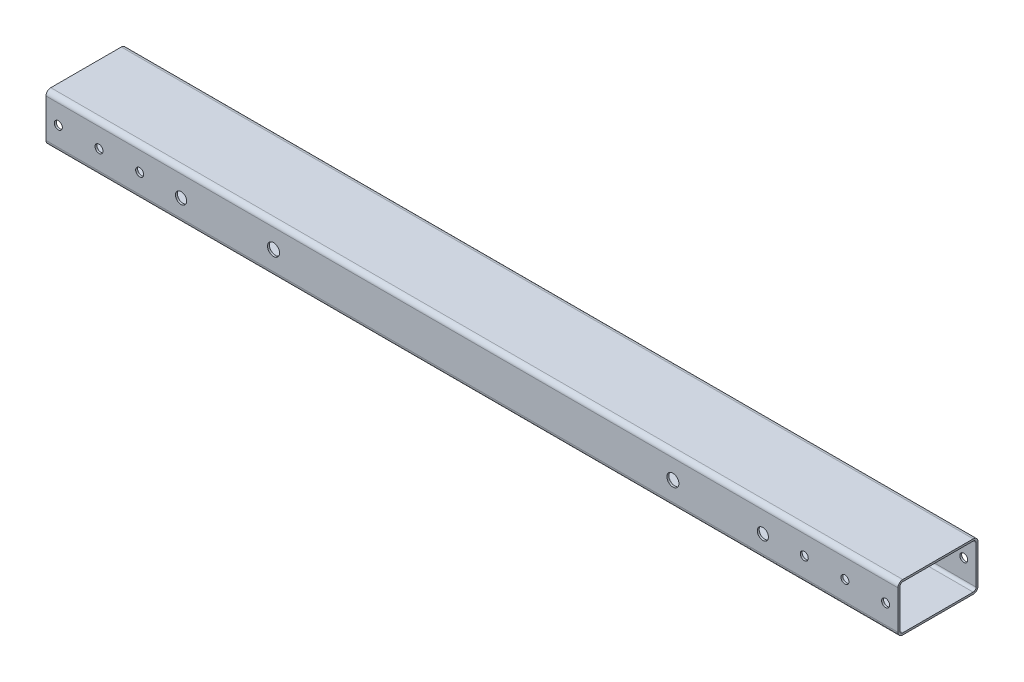
ISO-10303-21;
HEADER;
FILE_DESCRIPTION(('STEP AP214'),'2;1');
FILE_NAME('part.step','',(''),(''),'','','');
FILE_SCHEMA(('AUTOMOTIVE_DESIGN { 1 0 10303 214 1 1 1 1 }'));
ENDSEC;
DATA;
#1=APPLICATION_CONTEXT('core data for automotive mechanical design processes');
#2=APPLICATION_PROTOCOL_DEFINITION('international standard','automotive_design',2000,#1);
#3=PRODUCT_CONTEXT('',#1,'mechanical');
#4=PRODUCT('Part','Part','',(#3));
#5=PRODUCT_RELATED_PRODUCT_CATEGORY('part','',(#4));
#6=PRODUCT_DEFINITION_FORMATION('','',#4);
#7=PRODUCT_DEFINITION_CONTEXT('part definition',#1,'design');
#8=PRODUCT_DEFINITION('design','',#6,#7);
#9=PRODUCT_DEFINITION_SHAPE('','',#8);
#10=(LENGTH_UNIT() NAMED_UNIT(*) SI_UNIT(.MILLI.,.METRE.));
#11=(NAMED_UNIT(*) PLANE_ANGLE_UNIT() SI_UNIT($,.RADIAN.));
#12=(NAMED_UNIT(*) SI_UNIT($,.STERADIAN.) SOLID_ANGLE_UNIT());
#13=UNCERTAINTY_MEASURE_WITH_UNIT(LENGTH_MEASURE(1.E-05),#10,'distance_accuracy_value','');
#14=(GEOMETRIC_REPRESENTATION_CONTEXT(3) GLOBAL_UNCERTAINTY_ASSIGNED_CONTEXT((#13)) GLOBAL_UNIT_ASSIGNED_CONTEXT((#10,
#11,#12)) REPRESENTATION_CONTEXT('',''));
#15=CARTESIAN_POINT('',(0.,0.,0.));
#16=DIRECTION('',(0.,0.,1.));
#17=DIRECTION('',(1.,0.,0.));
#18=AXIS2_PLACEMENT_3D('',#15,#16,#17);
#19=CARTESIAN_POINT('',(532.,12.,22.));
#20=DIRECTION('',(-1.,0.,0.));
#21=DIRECTION('',(0.,0.,1.));
#22=AXIS2_PLACEMENT_3D('',#19,#20,#21);
#23=CYLINDRICAL_SURFACE('',#22,3.);
#24=CARTESIAN_POINT('',(0.,12.,22.));
#25=DIRECTION('',(1.,0.,0.));
#26=DIRECTION('',(0.,0.,-1.));
#27=AXIS2_PLACEMENT_3D('',#24,#25,#26);
#28=CIRCLE('',#27,3.);
#29=CARTESIAN_POINT('',(0.,15.,22.));
#30=VERTEX_POINT('',#29);
#31=CARTESIAN_POINT('',(0.,12.,25.));
#32=VERTEX_POINT('',#31);
#33=EDGE_CURVE('E256',#30,#32,#28,.T.);
#34=ORIENTED_EDGE('',*,*,#33,.T.);
#35=DIRECTION('',(-1.,0.,0.));
#36=VECTOR('',#35,1.);
#37=CARTESIAN_POINT('',(532.,12.,25.));
#38=LINE('',#37,#36);
#39=CARTESIAN_POINT('',(532.,12.,25.));
#40=VERTEX_POINT('',#39);
#41=EDGE_CURVE('E12',#40,#32,#38,.T.);
#42=ORIENTED_EDGE('',*,*,#41,.F.);
#43=CARTESIAN_POINT('',(532.,12.,22.));
#44=DIRECTION('',(1.,0.,0.));
#45=DIRECTION('',(0.,0.,-1.));
#46=AXIS2_PLACEMENT_3D('',#43,#44,#45);
#47=CIRCLE('',#46,3.);
#48=CARTESIAN_POINT('',(532.,15.,22.));
#49=VERTEX_POINT('',#48);
#50=EDGE_CURVE('E492',#49,#40,#47,.T.);
#51=ORIENTED_EDGE('',*,*,#50,.F.);
#52=DIRECTION('',(-1.,0.,0.));
#53=VECTOR('',#52,1.);
#54=CARTESIAN_POINT('',(532.,15.,22.));
#55=LINE('',#54,#53);
#56=EDGE_CURVE('E279',#49,#30,#55,.T.);
#57=ORIENTED_EDGE('',*,*,#56,.T.);
#58=EDGE_LOOP('',(#34,#42,#51,#57));
#59=FACE_BOUND('',#58,.T.);
#60=ADVANCED_FACE('F68',(#59),#23,.T.);
#61=CARTESIAN_POINT('',(532.,12.,25.));
#62=DIRECTION('',(0.,0.,-1.));
#63=DIRECTION('',(-1.,0.,0.));
#64=AXIS2_PLACEMENT_3D('',#61,#62,#63);
#65=PLANE('',#64);
#66=CARTESIAN_POINT('',(447.652173255853,-0.9847050473199,25.));
#67=DIRECTION('',(0.,0.,-1.));
#68=DIRECTION('',(-1.,0.,0.));
#69=AXIS2_PLACEMENT_3D('',#66,#67,#68);
#70=CIRCLE('',#69,3.50000000000002);
#71=CARTESIAN_POINT('',(444.152173255853,-0.9847050473199,25.));
#72=VERTEX_POINT('',#71);
#73=EDGE_CURVE('E360',#72,#72,#70,.T.);
#74=ORIENTED_EDGE('',*,*,#73,.T.);
#75=EDGE_LOOP('',(#74));
#76=FACE_BOUND('',#75,.T.);
#77=CARTESIAN_POINT('',(84.347826744147,-0.984705047320011,25.));
#78=DIRECTION('',(0.,0.,-1.));
#79=DIRECTION('',(-1.,0.,0.));
#80=AXIS2_PLACEMENT_3D('',#77,#78,#79);
#81=CIRCLE('',#80,3.50000000000001);
#82=CARTESIAN_POINT('',(80.847826744147,-0.984705047320011,25.));
#83=VERTEX_POINT('',#82);
#84=EDGE_CURVE('E376',#83,#83,#81,.T.);
#85=ORIENTED_EDGE('',*,*,#84,.T.);
#86=EDGE_LOOP('',(#85));
#87=FACE_BOUND('',#86,.T.);
#88=CARTESIAN_POINT('',(391.484705047324,0.,25.));
#89=DIRECTION('',(0.,0.,-1.));
#90=DIRECTION('',(-1.,0.,0.));
#91=AXIS2_PLACEMENT_3D('',#88,#89,#90);
#92=CIRCLE('',#91,3.74999999999998);
#93=CARTESIAN_POINT('',(387.734705047324,0.,25.));
#94=VERTEX_POINT('',#93);
#95=EDGE_CURVE('E353',#94,#94,#92,.T.);
#96=ORIENTED_EDGE('',*,*,#95,.T.);
#97=EDGE_LOOP('',(#96));
#98=FACE_BOUND('',#97,.T.);
#99=CARTESIAN_POINT('',(142.084705047324,0.,25.));
#100=DIRECTION('',(0.,0.,-1.));
#101=DIRECTION('',(-1.,0.,0.));
#102=AXIS2_PLACEMENT_3D('',#99,#100,#101);
#103=CIRCLE('',#102,3.75000000000001);
#104=CARTESIAN_POINT('',(138.334705047324,0.,25.));
#105=VERTEX_POINT('',#104);
#106=EDGE_CURVE('E382',#105,#105,#103,.T.);
#107=ORIENTED_EDGE('',*,*,#106,.T.);
#108=EDGE_LOOP('',(#107));
#109=FACE_BOUND('',#108,.T.);
#110=CARTESIAN_POINT('',(33.1,0.,25.));
#111=DIRECTION('',(0.,0.,-1.));
#112=DIRECTION('',(-1.,0.,0.));
#113=AXIS2_PLACEMENT_3D('',#110,#111,#112);
#114=CIRCLE('',#113,2.5);
#115=CARTESIAN_POINT('',(30.6,0.,25.));
#116=VERTEX_POINT('',#115);
#117=EDGE_CURVE('E411',#116,#116,#114,.T.);
#118=ORIENTED_EDGE('',*,*,#117,.T.);
#119=EDGE_LOOP('',(#118));
#120=FACE_BOUND('',#119,.T.);
#121=CARTESIAN_POINT('',(7.7,0.,25.));
#122=DIRECTION('',(0.,0.,-1.));
#123=DIRECTION('',(-1.,0.,0.));
#124=AXIS2_PLACEMENT_3D('',#121,#122,#123);
#125=CIRCLE('',#124,2.5);
#126=CARTESIAN_POINT('',(5.2,0.,25.));
#127=VERTEX_POINT('',#126);
#128=EDGE_CURVE('E419',#127,#127,#125,.T.);
#129=ORIENTED_EDGE('',*,*,#128,.T.);
#130=EDGE_LOOP('',(#129));
#131=FACE_BOUND('',#130,.T.);
#132=CARTESIAN_POINT('',(524.3,0.,25.));
#133=DIRECTION('',(0.,0.,-1.));
#134=DIRECTION('',(1.,0.,0.));
#135=AXIS2_PLACEMENT_3D('',#132,#133,#134);
#136=CIRCLE('',#135,2.50000000000014);
#137=CARTESIAN_POINT('',(526.8,0.,25.));
#138=VERTEX_POINT('',#137);
#139=EDGE_CURVE('E427',#138,#138,#136,.T.);
#140=ORIENTED_EDGE('',*,*,#139,.T.);
#141=EDGE_LOOP('',(#140));
#142=FACE_BOUND('',#141,.T.);
#143=CARTESIAN_POINT('',(498.9,0.,25.));
#144=DIRECTION('',(0.,0.,-1.));
#145=DIRECTION('',(1.,0.,0.));
#146=AXIS2_PLACEMENT_3D('',#143,#144,#145);
#147=CIRCLE('',#146,2.50000000000002);
#148=CARTESIAN_POINT('',(501.4,0.,25.));
#149=VERTEX_POINT('',#148);
#150=EDGE_CURVE('E402',#149,#149,#147,.T.);
#151=ORIENTED_EDGE('',*,*,#150,.T.);
#152=EDGE_LOOP('',(#151));
#153=FACE_BOUND('',#152,.T.);
#154=CARTESIAN_POINT('',(473.5,0.,25.));
#155=DIRECTION('',(0.,0.,-1.));
#156=DIRECTION('',(1.,0.,0.));
#157=AXIS2_PLACEMENT_3D('',#154,#155,#156);
#158=CIRCLE('',#157,2.50000000000002);
#159=CARTESIAN_POINT('',(476.,0.,25.));
#160=VERTEX_POINT('',#159);
#161=EDGE_CURVE('E397',#160,#160,#158,.T.);
#162=ORIENTED_EDGE('',*,*,#161,.T.);
#163=EDGE_LOOP('',(#162));
#164=FACE_BOUND('',#163,.T.);
#165=CARTESIAN_POINT('',(58.5,0.,25.));
#166=DIRECTION('',(0.,0.,-1.));
#167=DIRECTION('',(-1.,0.,0.));
#168=AXIS2_PLACEMENT_3D('',#165,#166,#167);
#169=CIRCLE('',#168,2.5);
#170=CARTESIAN_POINT('',(56.,0.,25.));
#171=VERTEX_POINT('',#170);
#172=EDGE_CURVE('E324',#171,#171,#169,.T.);
#173=ORIENTED_EDGE('',*,*,#172,.T.);
#174=EDGE_LOOP('',(#173));
#175=FACE_BOUND('',#174,.T.);
#176=DIRECTION('',(0.,-1.,0.));
#177=VECTOR('',#176,1.);
#178=CARTESIAN_POINT('',(0.,12.,25.));
#179=LINE('',#178,#177);
#180=CARTESIAN_POINT('',(0.,-12.,25.));
#181=VERTEX_POINT('',#180);
#182=EDGE_CURVE('E260',#32,#181,#179,.T.);
#183=ORIENTED_EDGE('',*,*,#182,.T.);
#184=DIRECTION('',(-1.,0.,0.));
#185=VECTOR('',#184,1.);
#186=CARTESIAN_POINT('',(532.,-12.,25.));
#187=LINE('',#186,#185);
#188=CARTESIAN_POINT('',(532.,-12.,25.));
#189=VERTEX_POINT('',#188);
#190=EDGE_CURVE('E79',#189,#181,#187,.T.);
#191=ORIENTED_EDGE('',*,*,#190,.F.);
#192=DIRECTION('',(0.,-1.,0.));
#193=VECTOR('',#192,1.);
#194=CARTESIAN_POINT('',(532.,12.,25.));
#195=LINE('',#194,#193);
#196=EDGE_CURVE('E495',#40,#189,#195,.T.);
#197=ORIENTED_EDGE('',*,*,#196,.F.);
#198=ORIENTED_EDGE('',*,*,#41,.T.);
#199=EDGE_LOOP('',(#183,#191,#197,#198));
#200=FACE_BOUND('',#199,.T.);
#201=ADVANCED_FACE('F591',(#76,#87,#98,#109,#120,#131,#142,#153,#164,#175,#200),#65,.F.);
#202=CARTESIAN_POINT('',(532.,-12.,22.));
#203=DIRECTION('',(-1.,0.,0.));
#204=DIRECTION('',(0.,0.,1.));
#205=AXIS2_PLACEMENT_3D('',#202,#203,#204);
#206=CYLINDRICAL_SURFACE('',#205,3.);
#207=CARTESIAN_POINT('',(0.,-12.,22.));
#208=DIRECTION('',(1.,0.,0.));
#209=DIRECTION('',(0.,0.,-1.));
#210=AXIS2_PLACEMENT_3D('',#207,#208,#209);
#211=CIRCLE('',#210,3.);
#212=CARTESIAN_POINT('',(0.,-15.,22.));
#213=VERTEX_POINT('',#212);
#214=EDGE_CURVE('E263',#181,#213,#211,.T.);
#215=ORIENTED_EDGE('',*,*,#214,.T.);
#216=DIRECTION('',(-1.,0.,0.));
#217=VECTOR('',#216,1.);
#218=CARTESIAN_POINT('',(532.,-15.,22.));
#219=LINE('',#218,#217);
#220=CARTESIAN_POINT('',(532.,-15.,22.));
#221=VERTEX_POINT('',#220);
#222=EDGE_CURVE('E290',#221,#213,#219,.T.);
#223=ORIENTED_EDGE('',*,*,#222,.F.);
#224=CARTESIAN_POINT('',(532.,-12.,22.));
#225=DIRECTION('',(1.,0.,0.));
#226=DIRECTION('',(0.,0.,-1.));
#227=AXIS2_PLACEMENT_3D('',#224,#225,#226);
#228=CIRCLE('',#227,3.);
#229=EDGE_CURVE('E498',#189,#221,#228,.T.);
#230=ORIENTED_EDGE('',*,*,#229,.F.);
#231=ORIENTED_EDGE('',*,*,#190,.T.);
#232=EDGE_LOOP('',(#215,#223,#230,#231));
#233=FACE_BOUND('',#232,.T.);
#234=ADVANCED_FACE('F596',(#233),#206,.T.);
#235=CARTESIAN_POINT('',(532.,-15.,-22.));
#236=DIRECTION('',(0.,1.,0.));
#237=DIRECTION('',(0.,0.,1.));
#238=AXIS2_PLACEMENT_3D('',#235,#236,#237);
#239=PLANE('',#238);
#240=DIRECTION('',(0.,0.,-1.));
#241=VECTOR('',#240,1.);
#242=CARTESIAN_POINT('',(0.,-15.,-22.));
#243=LINE('',#242,#241);
#244=CARTESIAN_POINT('',(0.,-15.,-22.));
#245=VERTEX_POINT('',#244);
#246=EDGE_CURVE('E266',#213,#245,#243,.T.);
#247=ORIENTED_EDGE('',*,*,#246,.T.);
#248=DIRECTION('',(-1.,0.,0.));
#249=VECTOR('',#248,1.);
#250=CARTESIAN_POINT('',(532.,-15.,-22.));
#251=LINE('',#250,#249);
#252=CARTESIAN_POINT('',(532.,-15.,-22.));
#253=VERTEX_POINT('',#252);
#254=EDGE_CURVE('E286',#253,#245,#251,.T.);
#255=ORIENTED_EDGE('',*,*,#254,.F.);
#256=DIRECTION('',(0.,0.,-1.));
#257=VECTOR('',#256,1.);
#258=CARTESIAN_POINT('',(532.,-15.,-22.));
#259=LINE('',#258,#257);
#260=EDGE_CURVE('E501',#221,#253,#259,.T.);
#261=ORIENTED_EDGE('',*,*,#260,.F.);
#262=ORIENTED_EDGE('',*,*,#222,.T.);
#263=EDGE_LOOP('',(#247,#255,#261,#262));
#264=FACE_BOUND('',#263,.T.);
#265=ADVANCED_FACE('F563',(#264),#239,.F.);
#266=CARTESIAN_POINT('',(532.,-12.,-22.));
#267=DIRECTION('',(-1.,0.,0.));
#268=DIRECTION('',(0.,0.,1.));
#269=AXIS2_PLACEMENT_3D('',#266,#267,#268);
#270=CYLINDRICAL_SURFACE('',#269,3.);
#271=CARTESIAN_POINT('',(0.,-12.,-22.));
#272=DIRECTION('',(1.,0.,0.));
#273=DIRECTION('',(0.,0.,-1.));
#274=AXIS2_PLACEMENT_3D('',#271,#272,#273);
#275=CIRCLE('',#274,3.);
#276=CARTESIAN_POINT('',(0.,-12.,-25.));
#277=VERTEX_POINT('',#276);
#278=EDGE_CURVE('E269',#245,#277,#275,.T.);
#279=ORIENTED_EDGE('',*,*,#278,.T.);
#280=DIRECTION('',(-1.,0.,0.));
#281=VECTOR('',#280,1.);
#282=CARTESIAN_POINT('',(532.,-12.,-25.));
#283=LINE('',#282,#281);
#284=CARTESIAN_POINT('',(532.,-12.,-25.));
#285=VERTEX_POINT('',#284);
#286=EDGE_CURVE('E211',#285,#277,#283,.T.);
#287=ORIENTED_EDGE('',*,*,#286,.F.);
#288=CARTESIAN_POINT('',(532.,-12.,-22.));
#289=DIRECTION('',(1.,0.,0.));
#290=DIRECTION('',(0.,0.,-1.));
#291=AXIS2_PLACEMENT_3D('',#288,#289,#290);
#292=CIRCLE('',#291,3.);
#293=EDGE_CURVE('E200',#253,#285,#292,.T.);
#294=ORIENTED_EDGE('',*,*,#293,.F.);
#295=ORIENTED_EDGE('',*,*,#254,.T.);
#296=EDGE_LOOP('',(#279,#287,#294,#295));
#297=FACE_BOUND('',#296,.T.);
#298=ADVANCED_FACE('F567',(#297),#270,.T.);
#299=CARTESIAN_POINT('',(532.,-12.,-25.));
#300=DIRECTION('',(0.,0.,1.));
#301=DIRECTION('',(1.,0.,0.));
#302=AXIS2_PLACEMENT_3D('',#299,#300,#301);
#303=PLANE('',#302);
#304=CARTESIAN_POINT('',(447.652173255853,-0.9847050473199,-25.));
#305=DIRECTION('',(0.,0.,-1.));
#306=DIRECTION('',(-1.,0.,0.));
#307=AXIS2_PLACEMENT_3D('',#304,#305,#306);
#308=CIRCLE('',#307,3.50000000000002);
#309=CARTESIAN_POINT('',(444.152173255853,-0.9847050473199,-25.));
#310=VERTEX_POINT('',#309);
#311=EDGE_CURVE('E366',#310,#310,#308,.T.);
#312=ORIENTED_EDGE('',*,*,#311,.F.);
#313=EDGE_LOOP('',(#312));
#314=FACE_BOUND('',#313,.T.);
#315=CARTESIAN_POINT('',(84.347826744147,-0.984705047320011,-25.));
#316=DIRECTION('',(0.,0.,-1.));
#317=DIRECTION('',(-1.,0.,0.));
#318=AXIS2_PLACEMENT_3D('',#315,#316,#317);
#319=CIRCLE('',#318,3.50000000000001);
#320=CARTESIAN_POINT('',(80.847826744147,-0.984705047320011,-25.));
#321=VERTEX_POINT('',#320);
#322=EDGE_CURVE('E371',#321,#321,#319,.T.);
#323=ORIENTED_EDGE('',*,*,#322,.F.);
#324=EDGE_LOOP('',(#323));
#325=FACE_BOUND('',#324,.T.);
#326=CARTESIAN_POINT('',(391.484705047324,0.,-25.));
#327=DIRECTION('',(0.,0.,-1.));
#328=DIRECTION('',(-1.,0.,0.));
#329=AXIS2_PLACEMENT_3D('',#326,#327,#328);
#330=CIRCLE('',#329,3.74999999999998);
#331=CARTESIAN_POINT('',(387.734705047324,0.,-25.));
#332=VERTEX_POINT('',#331);
#333=EDGE_CURVE('E385',#332,#332,#330,.T.);
#334=ORIENTED_EDGE('',*,*,#333,.F.);
#335=EDGE_LOOP('',(#334));
#336=FACE_BOUND('',#335,.T.);
#337=CARTESIAN_POINT('',(142.084705047324,0.,-25.));
#338=DIRECTION('',(0.,0.,-1.));
#339=DIRECTION('',(-1.,0.,0.));
#340=AXIS2_PLACEMENT_3D('',#337,#338,#339);
#341=CIRCLE('',#340,3.75000000000001);
#342=CARTESIAN_POINT('',(138.334705047324,0.,-25.));
#343=VERTEX_POINT('',#342);
#344=EDGE_CURVE('E388',#343,#343,#341,.T.);
#345=ORIENTED_EDGE('',*,*,#344,.F.);
#346=EDGE_LOOP('',(#345));
#347=FACE_BOUND('',#346,.T.);
#348=CARTESIAN_POINT('',(33.1,0.,-25.));
#349=DIRECTION('',(0.,0.,-1.));
#350=DIRECTION('',(-1.,0.,0.));
#351=AXIS2_PLACEMENT_3D('',#348,#349,#350);
#352=CIRCLE('',#351,2.5);
#353=CARTESIAN_POINT('',(30.6,0.,-25.));
#354=VERTEX_POINT('',#353);
#355=EDGE_CURVE('E406',#354,#354,#352,.T.);
#356=ORIENTED_EDGE('',*,*,#355,.F.);
#357=EDGE_LOOP('',(#356));
#358=FACE_BOUND('',#357,.T.);
#359=CARTESIAN_POINT('',(7.7,0.,-25.));
#360=DIRECTION('',(0.,0.,-1.));
#361=DIRECTION('',(-1.,0.,0.));
#362=AXIS2_PLACEMENT_3D('',#359,#360,#361);
#363=CIRCLE('',#362,2.5);
#364=CARTESIAN_POINT('',(5.2,0.,-25.));
#365=VERTEX_POINT('',#364);
#366=EDGE_CURVE('E415',#365,#365,#363,.T.);
#367=ORIENTED_EDGE('',*,*,#366,.F.);
#368=EDGE_LOOP('',(#367));
#369=FACE_BOUND('',#368,.T.);
#370=CARTESIAN_POINT('',(524.3,0.,-25.));
#371=DIRECTION('',(0.,0.,-1.));
#372=DIRECTION('',(1.,0.,0.));
#373=AXIS2_PLACEMENT_3D('',#370,#371,#372);
#374=CIRCLE('',#373,2.50000000000014);
#375=CARTESIAN_POINT('',(526.8,0.,-25.));
#376=VERTEX_POINT('',#375);
#377=EDGE_CURVE('E423',#376,#376,#374,.T.);
#378=ORIENTED_EDGE('',*,*,#377,.F.);
#379=EDGE_LOOP('',(#378));
#380=FACE_BOUND('',#379,.T.);
#381=CARTESIAN_POINT('',(498.9,0.,-25.));
#382=DIRECTION('',(0.,0.,-1.));
#383=DIRECTION('',(1.,0.,0.));
#384=AXIS2_PLACEMENT_3D('',#381,#382,#383);
#385=CIRCLE('',#384,2.50000000000002);
#386=CARTESIAN_POINT('',(501.4,0.,-25.));
#387=VERTEX_POINT('',#386);
#388=EDGE_CURVE('E431',#387,#387,#385,.T.);
#389=ORIENTED_EDGE('',*,*,#388,.F.);
#390=EDGE_LOOP('',(#389));
#391=FACE_BOUND('',#390,.T.);
#392=CARTESIAN_POINT('',(473.5,0.,-25.));
#393=DIRECTION('',(0.,0.,-1.));
#394=DIRECTION('',(1.,0.,0.));
#395=AXIS2_PLACEMENT_3D('',#392,#393,#394);
#396=CIRCLE('',#395,2.50000000000002);
#397=CARTESIAN_POINT('',(476.,0.,-25.));
#398=VERTEX_POINT('',#397);
#399=EDGE_CURVE('E398',#398,#398,#396,.T.);
#400=ORIENTED_EDGE('',*,*,#399,.F.);
#401=EDGE_LOOP('',(#400));
#402=FACE_BOUND('',#401,.T.);
#403=CARTESIAN_POINT('',(58.5,0.,-25.));
#404=DIRECTION('',(0.,0.,-1.));
#405=DIRECTION('',(-1.,0.,0.));
#406=AXIS2_PLACEMENT_3D('',#403,#404,#405);
#407=CIRCLE('',#406,2.5);
#408=CARTESIAN_POINT('',(56.,0.,-25.));
#409=VERTEX_POINT('',#408);
#410=EDGE_CURVE('E410',#409,#409,#407,.T.);
#411=ORIENTED_EDGE('',*,*,#410,.F.);
#412=EDGE_LOOP('',(#411));
#413=FACE_BOUND('',#412,.T.);
#414=DIRECTION('',(0.,1.,0.));
#415=VECTOR('',#414,1.);
#416=CARTESIAN_POINT('',(0.,-12.,-25.));
#417=LINE('',#416,#415);
#418=CARTESIAN_POINT('',(0.,12.,-25.));
#419=VERTEX_POINT('',#418);
#420=EDGE_CURVE('E209',#277,#419,#417,.T.);
#421=ORIENTED_EDGE('',*,*,#420,.T.);
#422=DIRECTION('',(-1.,0.,0.));
#423=VECTOR('',#422,1.);
#424=CARTESIAN_POINT('',(532.,12.,-25.));
#425=LINE('',#424,#423);
#426=CARTESIAN_POINT('',(532.,12.,-25.));
#427=VERTEX_POINT('',#426);
#428=EDGE_CURVE('E206',#427,#419,#425,.T.);
#429=ORIENTED_EDGE('',*,*,#428,.F.);
#430=DIRECTION('',(0.,1.,0.));
#431=VECTOR('',#430,1.);
#432=CARTESIAN_POINT('',(532.,-12.,-25.));
#433=LINE('',#432,#431);
#434=EDGE_CURVE('E194',#285,#427,#433,.T.);
#435=ORIENTED_EDGE('',*,*,#434,.F.);
#436=ORIENTED_EDGE('',*,*,#286,.T.);
#437=EDGE_LOOP('',(#421,#429,#435,#436));
#438=FACE_BOUND('',#437,.T.);
#439=ADVANCED_FACE('F207',(#314,#325,#336,#347,#358,#369,#380,#391,#402,#413,#438),#303,.F.);
#440=CARTESIAN_POINT('',(532.,12.,-22.));
#441=DIRECTION('',(-1.,0.,0.));
#442=DIRECTION('',(0.,0.,1.));
#443=AXIS2_PLACEMENT_3D('',#440,#441,#442);
#444=CYLINDRICAL_SURFACE('',#443,3.);
#445=CARTESIAN_POINT('',(0.,12.,-22.));
#446=DIRECTION('',(1.,0.,0.));
#447=DIRECTION('',(0.,0.,-1.));
#448=AXIS2_PLACEMENT_3D('',#445,#446,#447);
#449=CIRCLE('',#448,3.);
#450=CARTESIAN_POINT('',(0.,15.,-22.));
#451=VERTEX_POINT('',#450);
#452=EDGE_CURVE('E141',#419,#451,#449,.T.);
#453=ORIENTED_EDGE('',*,*,#452,.T.);
#454=DIRECTION('',(-1.,0.,0.));
#455=VECTOR('',#454,1.);
#456=CARTESIAN_POINT('',(532.,15.,-22.));
#457=LINE('',#456,#455);
#458=CARTESIAN_POINT('',(532.,15.,-22.));
#459=VERTEX_POINT('',#458);
#460=EDGE_CURVE('E212',#459,#451,#457,.T.);
#461=ORIENTED_EDGE('',*,*,#460,.F.);
#462=CARTESIAN_POINT('',(532.,12.,-22.));
#463=DIRECTION('',(1.,0.,0.));
#464=DIRECTION('',(0.,0.,-1.));
#465=AXIS2_PLACEMENT_3D('',#462,#463,#464);
#466=CIRCLE('',#465,3.);
#467=EDGE_CURVE('E198',#427,#459,#466,.T.);
#468=ORIENTED_EDGE('',*,*,#467,.F.);
#469=ORIENTED_EDGE('',*,*,#428,.T.);
#470=EDGE_LOOP('',(#453,#461,#468,#469));
#471=FACE_BOUND('',#470,.T.);
#472=ADVANCED_FACE('F214',(#471),#444,.T.);
#473=CARTESIAN_POINT('',(532.,-12.,22.));
#474=DIRECTION('',(-1.,0.,0.));
#475=DIRECTION('',(0.,0.,1.));
#476=AXIS2_PLACEMENT_3D('',#473,#474,#475);
#477=CYLINDRICAL_SURFACE('',#476,1.8);
#478=CARTESIAN_POINT('',(0.,-12.,22.));
#479=DIRECTION('',(1.,0.,0.));
#480=DIRECTION('',(0.,0.,-1.));
#481=AXIS2_PLACEMENT_3D('',#478,#479,#480);
#482=CIRCLE('',#481,1.8);
#483=CARTESIAN_POINT('',(0.,-12.,23.8));
#484=VERTEX_POINT('',#483);
#485=CARTESIAN_POINT('',(0.,-13.8,22.));
#486=VERTEX_POINT('',#485);
#487=EDGE_CURVE('E223',#484,#486,#482,.T.);
#488=ORIENTED_EDGE('',*,*,#487,.F.);
#489=DIRECTION('',(-1.,0.,0.));
#490=VECTOR('',#489,1.);
#491=CARTESIAN_POINT('',(532.,-12.,23.8));
#492=LINE('',#491,#490);
#493=CARTESIAN_POINT('',(532.,-12.,23.8));
#494=VERTEX_POINT('',#493);
#495=EDGE_CURVE('E155',#494,#484,#492,.T.);
#496=ORIENTED_EDGE('',*,*,#495,.F.);
#497=CARTESIAN_POINT('',(532.,-12.,22.));
#498=DIRECTION('',(1.,0.,0.));
#499=DIRECTION('',(0.,0.,-1.));
#500=AXIS2_PLACEMENT_3D('',#497,#498,#499);
#501=CIRCLE('',#500,1.8);
#502=CARTESIAN_POINT('',(532.,-13.8,22.));
#503=VERTEX_POINT('',#502);
#504=EDGE_CURVE('E278',#494,#503,#501,.T.);
#505=ORIENTED_EDGE('',*,*,#504,.T.);
#506=DIRECTION('',(-1.,0.,0.));
#507=VECTOR('',#506,1.);
#508=CARTESIAN_POINT('',(532.,-13.8,22.));
#509=LINE('',#508,#507);
#510=EDGE_CURVE('E219',#503,#486,#509,.T.);
#511=ORIENTED_EDGE('',*,*,#510,.T.);
#512=EDGE_LOOP('',(#488,#496,#505,#511));
#513=FACE_BOUND('',#512,.T.);
#514=ADVANCED_FACE('F70',(#513),#477,.F.);
#515=CARTESIAN_POINT('',(532.,12.,23.8));
#516=DIRECTION('',(0.,0.,-1.));
#517=DIRECTION('',(-1.,0.,0.));
#518=AXIS2_PLACEMENT_3D('',#515,#516,#517);
#519=PLANE('',#518);
#520=CARTESIAN_POINT('',(447.652173255853,-0.9847050473199,23.8));
#521=DIRECTION('',(0.,0.,-1.));
#522=DIRECTION('',(-1.,0.,0.));
#523=AXIS2_PLACEMENT_3D('',#520,#521,#522);
#524=CIRCLE('',#523,3.50000000000002);
#525=CARTESIAN_POINT('',(444.152173255853,-0.9847050473199,23.8));
#526=VERTEX_POINT('',#525);
#527=EDGE_CURVE('E379',#526,#526,#524,.T.);
#528=ORIENTED_EDGE('',*,*,#527,.F.);
#529=EDGE_LOOP('',(#528));
#530=FACE_BOUND('',#529,.T.);
#531=CARTESIAN_POINT('',(84.347826744147,-0.984705047320011,23.8));
#532=DIRECTION('',(0.,0.,-1.));
#533=DIRECTION('',(-1.,0.,0.));
#534=AXIS2_PLACEMENT_3D('',#531,#532,#533);
#535=CIRCLE('',#534,3.50000000000001);
#536=CARTESIAN_POINT('',(80.847826744147,-0.984705047320011,23.8));
#537=VERTEX_POINT('',#536);
#538=EDGE_CURVE('E359',#537,#537,#535,.T.);
#539=ORIENTED_EDGE('',*,*,#538,.F.);
#540=EDGE_LOOP('',(#539));
#541=FACE_BOUND('',#540,.T.);
#542=CARTESIAN_POINT('',(391.484705047324,0.,23.8));
#543=DIRECTION('',(0.,0.,-1.));
#544=DIRECTION('',(-1.,0.,0.));
#545=AXIS2_PLACEMENT_3D('',#542,#543,#544);
#546=CIRCLE('',#545,3.74999999999998);
#547=CARTESIAN_POINT('',(387.734705047324,0.,23.8));
#548=VERTEX_POINT('',#547);
#549=EDGE_CURVE('E356',#548,#548,#546,.T.);
#550=ORIENTED_EDGE('',*,*,#549,.F.);
#551=EDGE_LOOP('',(#550));
#552=FACE_BOUND('',#551,.T.);
#553=CARTESIAN_POINT('',(142.084705047324,0.,23.8));
#554=DIRECTION('',(0.,0.,-1.));
#555=DIRECTION('',(-1.,0.,0.));
#556=AXIS2_PLACEMENT_3D('',#553,#554,#555);
#557=CIRCLE('',#556,3.75000000000001);
#558=CARTESIAN_POINT('',(138.334705047324,0.,23.8));
#559=VERTEX_POINT('',#558);
#560=EDGE_CURVE('E352',#559,#559,#557,.T.);
#561=ORIENTED_EDGE('',*,*,#560,.F.);
#562=EDGE_LOOP('',(#561));
#563=FACE_BOUND('',#562,.T.);
#564=CARTESIAN_POINT('',(33.1,0.,23.8));
#565=DIRECTION('',(0.,0.,-1.));
#566=DIRECTION('',(-1.,0.,0.));
#567=AXIS2_PLACEMENT_3D('',#564,#565,#566);
#568=CIRCLE('',#567,2.5);
#569=CARTESIAN_POINT('',(30.6,0.,23.8));
#570=VERTEX_POINT('',#569);
#571=EDGE_CURVE('E228',#570,#570,#568,.T.);
#572=ORIENTED_EDGE('',*,*,#571,.F.);
#573=EDGE_LOOP('',(#572));
#574=FACE_BOUND('',#573,.T.);
#575=CARTESIAN_POINT('',(7.7,0.,23.8));
#576=DIRECTION('',(0.,0.,-1.));
#577=DIRECTION('',(-1.,0.,0.));
#578=AXIS2_PLACEMENT_3D('',#575,#576,#577);
#579=CIRCLE('',#578,2.5);
#580=CARTESIAN_POINT('',(5.2,0.,23.8));
#581=VERTEX_POINT('',#580);
#582=EDGE_CURVE('E344',#581,#581,#579,.T.);
#583=ORIENTED_EDGE('',*,*,#582,.F.);
#584=EDGE_LOOP('',(#583));
#585=FACE_BOUND('',#584,.T.);
#586=CARTESIAN_POINT('',(524.3,0.,23.8));
#587=DIRECTION('',(0.,0.,-1.));
#588=DIRECTION('',(-1.,0.,0.));
#589=AXIS2_PLACEMENT_3D('',#586,#587,#588);
#590=CIRCLE('',#589,2.50000000000014);
#591=CARTESIAN_POINT('',(521.8,0.,23.8));
#592=VERTEX_POINT('',#591);
#593=EDGE_CURVE('E339',#592,#592,#590,.T.);
#594=ORIENTED_EDGE('',*,*,#593,.F.);
#595=EDGE_LOOP('',(#594));
#596=FACE_BOUND('',#595,.T.);
#597=CARTESIAN_POINT('',(498.9,0.,23.8));
#598=DIRECTION('',(0.,0.,-1.));
#599=DIRECTION('',(-1.,0.,0.));
#600=AXIS2_PLACEMENT_3D('',#597,#598,#599);
#601=CIRCLE('',#600,2.50000000000002);
#602=CARTESIAN_POINT('',(496.4,0.,23.8));
#603=VERTEX_POINT('',#602);
#604=EDGE_CURVE('E334',#603,#603,#601,.T.);
#605=ORIENTED_EDGE('',*,*,#604,.F.);
#606=EDGE_LOOP('',(#605));
#607=FACE_BOUND('',#606,.T.);
#608=CARTESIAN_POINT('',(473.5,0.,23.8));
#609=DIRECTION('',(0.,0.,-1.));
#610=DIRECTION('',(-1.,0.,0.));
#611=AXIS2_PLACEMENT_3D('',#608,#609,#610);
#612=CIRCLE('',#611,2.50000000000002);
#613=CARTESIAN_POINT('',(471.,0.,23.8));
#614=VERTEX_POINT('',#613);
#615=EDGE_CURVE('E329',#614,#614,#612,.T.);
#616=ORIENTED_EDGE('',*,*,#615,.F.);
#617=EDGE_LOOP('',(#616));
#618=FACE_BOUND('',#617,.T.);
#619=CARTESIAN_POINT('',(58.5,0.,23.8));
#620=DIRECTION('',(0.,0.,-1.));
#621=DIRECTION('',(-1.,0.,0.));
#622=AXIS2_PLACEMENT_3D('',#619,#620,#621);
#623=CIRCLE('',#622,2.5);
#624=CARTESIAN_POINT('',(56.,0.,23.8));
#625=VERTEX_POINT('',#624);
#626=EDGE_CURVE('E323',#625,#625,#623,.T.);
#627=ORIENTED_EDGE('',*,*,#626,.F.);
#628=EDGE_LOOP('',(#627));
#629=FACE_BOUND('',#628,.T.);
#630=DIRECTION('',(0.,-1.,0.));
#631=VECTOR('',#630,1.);
#632=CARTESIAN_POINT('',(0.,12.,23.8));
#633=LINE('',#632,#631);
#634=CARTESIAN_POINT('',(0.,12.,23.8));
#635=VERTEX_POINT('',#634);
#636=EDGE_CURVE('E227',#635,#484,#633,.T.);
#637=ORIENTED_EDGE('',*,*,#636,.F.);
#638=DIRECTION('',(-1.,0.,0.));
#639=VECTOR('',#638,1.);
#640=CARTESIAN_POINT('',(532.,12.,23.8));
#641=LINE('',#640,#639);
#642=CARTESIAN_POINT('',(532.,12.,23.8));
#643=VERTEX_POINT('',#642);
#644=EDGE_CURVE('E314',#643,#635,#641,.T.);
#645=ORIENTED_EDGE('',*,*,#644,.F.);
#646=DIRECTION('',(0.,-1.,0.));
#647=VECTOR('',#646,1.);
#648=CARTESIAN_POINT('',(532.,12.,23.8));
#649=LINE('',#648,#647);
#650=EDGE_CURVE('E464',#643,#494,#649,.T.);
#651=ORIENTED_EDGE('',*,*,#650,.T.);
#652=ORIENTED_EDGE('',*,*,#495,.T.);
#653=EDGE_LOOP('',(#637,#645,#651,#652));
#654=FACE_BOUND('',#653,.T.);
#655=ADVANCED_FACE('F617',(#530,#541,#552,#563,#574,#585,#596,#607,#618,#629,#654),#519,.T.);
#656=CARTESIAN_POINT('',(532.,12.,22.));
#657=DIRECTION('',(-1.,0.,0.));
#658=DIRECTION('',(0.,0.,1.));
#659=AXIS2_PLACEMENT_3D('',#656,#657,#658);
#660=CYLINDRICAL_SURFACE('',#659,1.8);
#661=CARTESIAN_POINT('',(0.,12.,22.));
#662=DIRECTION('',(1.,0.,0.));
#663=DIRECTION('',(0.,0.,-1.));
#664=AXIS2_PLACEMENT_3D('',#661,#662,#663);
#665=CIRCLE('',#664,1.8);
#666=CARTESIAN_POINT('',(0.,13.8,22.));
#667=VERTEX_POINT('',#666);
#668=EDGE_CURVE('E232',#667,#635,#665,.T.);
#669=ORIENTED_EDGE('',*,*,#668,.F.);
#670=DIRECTION('',(-1.,0.,0.));
#671=VECTOR('',#670,1.);
#672=CARTESIAN_POINT('',(532.,13.8,22.));
#673=LINE('',#672,#671);
#674=CARTESIAN_POINT('',(532.,13.8,22.));
#675=VERTEX_POINT('',#674);
#676=EDGE_CURVE('E311',#675,#667,#673,.T.);
#677=ORIENTED_EDGE('',*,*,#676,.F.);
#678=CARTESIAN_POINT('',(532.,12.,22.));
#679=DIRECTION('',(1.,0.,0.));
#680=DIRECTION('',(0.,0.,-1.));
#681=AXIS2_PLACEMENT_3D('',#678,#679,#680);
#682=CIRCLE('',#681,1.8);
#683=EDGE_CURVE('E468',#675,#643,#682,.T.);
#684=ORIENTED_EDGE('',*,*,#683,.T.);
#685=ORIENTED_EDGE('',*,*,#644,.T.);
#686=EDGE_LOOP('',(#669,#677,#684,#685));
#687=FACE_BOUND('',#686,.T.);
#688=ADVANCED_FACE('F614',(#687),#660,.F.);
#689=CARTESIAN_POINT('',(532.,13.8,22.));
#690=DIRECTION('',(0.,-1.,0.));
#691=DIRECTION('',(0.,0.,-1.));
#692=AXIS2_PLACEMENT_3D('',#689,#690,#691);
#693=PLANE('',#692);
#694=DIRECTION('',(0.,0.,1.));
#695=VECTOR('',#694,1.);
#696=CARTESIAN_POINT('',(0.,13.8,22.));
#697=LINE('',#696,#695);
#698=CARTESIAN_POINT('',(0.,13.8,-22.));
#699=VERTEX_POINT('',#698);
#700=EDGE_CURVE('E236',#699,#667,#697,.T.);
#701=ORIENTED_EDGE('',*,*,#700,.F.);
#702=DIRECTION('',(-1.,0.,0.));
#703=VECTOR('',#702,1.);
#704=CARTESIAN_POINT('',(532.,13.8,-22.));
#705=LINE('',#704,#703);
#706=CARTESIAN_POINT('',(532.,13.8,-22.));
#707=VERTEX_POINT('',#706);
#708=EDGE_CURVE('E308',#707,#699,#705,.T.);
#709=ORIENTED_EDGE('',*,*,#708,.F.);
#710=DIRECTION('',(0.,0.,1.));
#711=VECTOR('',#710,1.);
#712=CARTESIAN_POINT('',(532.,13.8,22.));
#713=LINE('',#712,#711);
#714=EDGE_CURVE('E472',#707,#675,#713,.T.);
#715=ORIENTED_EDGE('',*,*,#714,.T.);
#716=ORIENTED_EDGE('',*,*,#676,.T.);
#717=EDGE_LOOP('',(#701,#709,#715,#716));
#718=FACE_BOUND('',#717,.T.);
#719=ADVANCED_FACE('F610',(#718),#693,.T.);
#720=CARTESIAN_POINT('',(532.,12.,-22.));
#721=DIRECTION('',(-1.,0.,0.));
#722=DIRECTION('',(0.,0.,1.));
#723=AXIS2_PLACEMENT_3D('',#720,#721,#722);
#724=CYLINDRICAL_SURFACE('',#723,1.8);
#725=CARTESIAN_POINT('',(0.,12.,-22.));
#726=DIRECTION('',(1.,0.,0.));
#727=DIRECTION('',(0.,0.,-1.));
#728=AXIS2_PLACEMENT_3D('',#725,#726,#727);
#729=CIRCLE('',#728,1.8);
#730=CARTESIAN_POINT('',(0.,12.,-23.8));
#731=VERTEX_POINT('',#730);
#732=EDGE_CURVE('E240',#731,#699,#729,.T.);
#733=ORIENTED_EDGE('',*,*,#732,.F.);
#734=DIRECTION('',(-1.,0.,0.));
#735=VECTOR('',#734,1.);
#736=CARTESIAN_POINT('',(532.,12.,-23.8));
#737=LINE('',#736,#735);
#738=CARTESIAN_POINT('',(532.,12.,-23.8));
#739=VERTEX_POINT('',#738);
#740=EDGE_CURVE('E305',#739,#731,#737,.T.);
#741=ORIENTED_EDGE('',*,*,#740,.F.);
#742=CARTESIAN_POINT('',(532.,12.,-22.));
#743=DIRECTION('',(1.,0.,0.));
#744=DIRECTION('',(0.,0.,-1.));
#745=AXIS2_PLACEMENT_3D('',#742,#743,#744);
#746=CIRCLE('',#745,1.8);
#747=EDGE_CURVE('E476',#739,#707,#746,.T.);
#748=ORIENTED_EDGE('',*,*,#747,.T.);
#749=ORIENTED_EDGE('',*,*,#708,.T.);
#750=EDGE_LOOP('',(#733,#741,#748,#749));
#751=FACE_BOUND('',#750,.T.);
#752=ADVANCED_FACE('F606',(#751),#724,.F.);
#753=CARTESIAN_POINT('',(532.,-12.,-23.8));
#754=DIRECTION('',(0.,0.,1.));
#755=DIRECTION('',(1.,0.,0.));
#756=AXIS2_PLACEMENT_3D('',#753,#754,#755);
#757=PLANE('',#756);
#758=CARTESIAN_POINT('',(447.652173255853,-0.9847050473199,-23.8));
#759=DIRECTION('',(0.,0.,1.));
#760=DIRECTION('',(1.,0.,0.));
#761=AXIS2_PLACEMENT_3D('',#758,#759,#760);
#762=CIRCLE('',#761,3.50000000000002);
#763=CARTESIAN_POINT('',(451.152173255853,-0.9847050473199,-23.8));
#764=VERTEX_POINT('',#763);
#765=EDGE_CURVE('E72',#764,#764,#762,.T.);
#766=ORIENTED_EDGE('',*,*,#765,.F.);
#767=EDGE_LOOP('',(#766));
#768=FACE_BOUND('',#767,.T.);
#769=CARTESIAN_POINT('',(84.347826744147,-0.984705047320011,-23.8));
#770=DIRECTION('',(0.,0.,1.));
#771=DIRECTION('',(1.,0.,0.));
#772=AXIS2_PLACEMENT_3D('',#769,#770,#771);
#773=CIRCLE('',#772,3.50000000000001);
#774=CARTESIAN_POINT('',(87.847826744147,-0.984705047320011,-23.8));
#775=VERTEX_POINT('',#774);
#776=EDGE_CURVE('E357',#775,#775,#773,.T.);
#777=ORIENTED_EDGE('',*,*,#776,.F.);
#778=EDGE_LOOP('',(#777));
#779=FACE_BOUND('',#778,.T.);
#780=CARTESIAN_POINT('',(391.484705047324,0.,-23.8));
#781=DIRECTION('',(0.,0.,1.));
#782=DIRECTION('',(1.,0.,0.));
#783=AXIS2_PLACEMENT_3D('',#780,#781,#782);
#784=CIRCLE('',#783,3.74999999999998);
#785=CARTESIAN_POINT('',(395.234705047324,0.,-23.8));
#786=VERTEX_POINT('',#785);
#787=EDGE_CURVE('E354',#786,#786,#784,.T.);
#788=ORIENTED_EDGE('',*,*,#787,.F.);
#789=EDGE_LOOP('',(#788));
#790=FACE_BOUND('',#789,.T.);
#791=CARTESIAN_POINT('',(142.084705047324,0.,-23.8));
#792=DIRECTION('',(0.,0.,1.));
#793=DIRECTION('',(1.,0.,0.));
#794=AXIS2_PLACEMENT_3D('',#791,#792,#793);
#795=CIRCLE('',#794,3.75000000000001);
#796=CARTESIAN_POINT('',(145.834705047324,0.,-23.8));
#797=VERTEX_POINT('',#796);
#798=EDGE_CURVE('E349',#797,#797,#795,.T.);
#799=ORIENTED_EDGE('',*,*,#798,.F.);
#800=EDGE_LOOP('',(#799));
#801=FACE_BOUND('',#800,.T.);
#802=CARTESIAN_POINT('',(33.1,0.,-23.8));
#803=DIRECTION('',(0.,0.,1.));
#804=DIRECTION('',(1.,0.,0.));
#805=AXIS2_PLACEMENT_3D('',#802,#803,#804);
#806=CIRCLE('',#805,2.5);
#807=CARTESIAN_POINT('',(35.6,0.,-23.8));
#808=VERTEX_POINT('',#807);
#809=EDGE_CURVE('E345',#808,#808,#806,.T.);
#810=ORIENTED_EDGE('',*,*,#809,.F.);
#811=EDGE_LOOP('',(#810));
#812=FACE_BOUND('',#811,.T.);
#813=CARTESIAN_POINT('',(7.7,0.,-23.8));
#814=DIRECTION('',(0.,0.,1.));
#815=DIRECTION('',(1.,0.,0.));
#816=AXIS2_PLACEMENT_3D('',#813,#814,#815);
#817=CIRCLE('',#816,2.5);
#818=CARTESIAN_POINT('',(10.2,0.,-23.8));
#819=VERTEX_POINT('',#818);
#820=EDGE_CURVE('E340',#819,#819,#817,.T.);
#821=ORIENTED_EDGE('',*,*,#820,.F.);
#822=EDGE_LOOP('',(#821));
#823=FACE_BOUND('',#822,.T.);
#824=CARTESIAN_POINT('',(524.3,0.,-23.8));
#825=DIRECTION('',(0.,0.,1.));
#826=DIRECTION('',(1.,0.,0.));
#827=AXIS2_PLACEMENT_3D('',#824,#825,#826);
#828=CIRCLE('',#827,2.50000000000014);
#829=CARTESIAN_POINT('',(526.8,0.,-23.8));
#830=VERTEX_POINT('',#829);
#831=EDGE_CURVE('E335',#830,#830,#828,.T.);
#832=ORIENTED_EDGE('',*,*,#831,.F.);
#833=EDGE_LOOP('',(#832));
#834=FACE_BOUND('',#833,.T.);
#835=CARTESIAN_POINT('',(498.9,0.,-23.8));
#836=DIRECTION('',(0.,0.,1.));
#837=DIRECTION('',(1.,0.,0.));
#838=AXIS2_PLACEMENT_3D('',#835,#836,#837);
#839=CIRCLE('',#838,2.50000000000002);
#840=CARTESIAN_POINT('',(501.4,0.,-23.8));
#841=VERTEX_POINT('',#840);
#842=EDGE_CURVE('E330',#841,#841,#839,.T.);
#843=ORIENTED_EDGE('',*,*,#842,.F.);
#844=EDGE_LOOP('',(#843));
#845=FACE_BOUND('',#844,.T.);
#846=CARTESIAN_POINT('',(473.5,0.,-23.8));
#847=DIRECTION('',(0.,0.,1.));
#848=DIRECTION('',(1.,0.,0.));
#849=AXIS2_PLACEMENT_3D('',#846,#847,#848);
#850=CIRCLE('',#849,2.50000000000002);
#851=CARTESIAN_POINT('',(476.,0.,-23.8));
#852=VERTEX_POINT('',#851);
#853=EDGE_CURVE('E325',#852,#852,#850,.T.);
#854=ORIENTED_EDGE('',*,*,#853,.F.);
#855=EDGE_LOOP('',(#854));
#856=FACE_BOUND('',#855,.T.);
#857=CARTESIAN_POINT('',(58.5,0.,-23.8));
#858=DIRECTION('',(0.,0.,1.));
#859=DIRECTION('',(1.,0.,0.));
#860=AXIS2_PLACEMENT_3D('',#857,#858,#859);
#861=CIRCLE('',#860,2.5);
#862=CARTESIAN_POINT('',(61.,0.,-23.8));
#863=VERTEX_POINT('',#862);
#864=EDGE_CURVE('E319',#863,#863,#861,.T.);
#865=ORIENTED_EDGE('',*,*,#864,.F.);
#866=EDGE_LOOP('',(#865));
#867=FACE_BOUND('',#866,.T.);
#868=DIRECTION('',(0.,1.,0.));
#869=VECTOR('',#868,1.);
#870=CARTESIAN_POINT('',(0.,-12.,-23.8));
#871=LINE('',#870,#869);
#872=CARTESIAN_POINT('',(0.,-12.,-23.8));
#873=VERTEX_POINT('',#872);
#874=EDGE_CURVE('E244',#873,#731,#871,.T.);
#875=ORIENTED_EDGE('',*,*,#874,.F.);
#876=DIRECTION('',(-1.,0.,0.));
#877=VECTOR('',#876,1.);
#878=CARTESIAN_POINT('',(532.,-12.,-23.8));
#879=LINE('',#878,#877);
#880=CARTESIAN_POINT('',(532.,-12.,-23.8));
#881=VERTEX_POINT('',#880);
#882=EDGE_CURVE('E302',#881,#873,#879,.T.);
#883=ORIENTED_EDGE('',*,*,#882,.F.);
#884=DIRECTION('',(0.,1.,0.));
#885=VECTOR('',#884,1.);
#886=CARTESIAN_POINT('',(532.,-12.,-23.8));
#887=LINE('',#886,#885);
#888=EDGE_CURVE('E480',#881,#739,#887,.T.);
#889=ORIENTED_EDGE('',*,*,#888,.T.);
#890=ORIENTED_EDGE('',*,*,#740,.T.);
#891=EDGE_LOOP('',(#875,#883,#889,#890));
#892=FACE_BOUND('',#891,.T.);
#893=ADVANCED_FACE('F602',(#768,#779,#790,#801,#812,#823,#834,#845,#856,#867,#892),#757,.T.);
#894=CARTESIAN_POINT('',(532.,-12.,-22.));
#895=DIRECTION('',(-1.,0.,0.));
#896=DIRECTION('',(0.,0.,1.));
#897=AXIS2_PLACEMENT_3D('',#894,#895,#896);
#898=CYLINDRICAL_SURFACE('',#897,1.8);
#899=CARTESIAN_POINT('',(0.,-12.,-22.));
#900=DIRECTION('',(1.,0.,0.));
#901=DIRECTION('',(0.,0.,-1.));
#902=AXIS2_PLACEMENT_3D('',#899,#900,#901);
#903=CIRCLE('',#902,1.8);
#904=CARTESIAN_POINT('',(0.,-13.8,-22.));
#905=VERTEX_POINT('',#904);
#906=EDGE_CURVE('E248',#905,#873,#903,.T.);
#907=ORIENTED_EDGE('',*,*,#906,.F.);
#908=DIRECTION('',(-1.,0.,0.));
#909=VECTOR('',#908,1.);
#910=CARTESIAN_POINT('',(532.,-13.8,-22.));
#911=LINE('',#910,#909);
#912=CARTESIAN_POINT('',(532.,-13.8,-22.));
#913=VERTEX_POINT('',#912);
#914=EDGE_CURVE('E299',#913,#905,#911,.T.);
#915=ORIENTED_EDGE('',*,*,#914,.F.);
#916=CARTESIAN_POINT('',(532.,-12.,-22.));
#917=DIRECTION('',(1.,0.,0.));
#918=DIRECTION('',(0.,0.,-1.));
#919=AXIS2_PLACEMENT_3D('',#916,#917,#918);
#920=CIRCLE('',#919,1.8);
#921=EDGE_CURVE('E484',#913,#881,#920,.T.);
#922=ORIENTED_EDGE('',*,*,#921,.T.);
#923=ORIENTED_EDGE('',*,*,#882,.T.);
#924=EDGE_LOOP('',(#907,#915,#922,#923));
#925=FACE_BOUND('',#924,.T.);
#926=ADVANCED_FACE('F585',(#925),#898,.F.);
#927=CARTESIAN_POINT('',(532.,-13.8,-22.));
#928=DIRECTION('',(0.,1.,0.));
#929=DIRECTION('',(0.,0.,1.));
#930=AXIS2_PLACEMENT_3D('',#927,#928,#929);
#931=PLANE('',#930);
#932=DIRECTION('',(0.,0.,-1.));
#933=VECTOR('',#932,1.);
#934=CARTESIAN_POINT('',(0.,-13.8,-22.));
#935=LINE('',#934,#933);
#936=EDGE_CURVE('E252',#486,#905,#935,.T.);
#937=ORIENTED_EDGE('',*,*,#936,.F.);
#938=ORIENTED_EDGE('',*,*,#510,.F.);
#939=DIRECTION('',(0.,0.,-1.));
#940=VECTOR('',#939,1.);
#941=CARTESIAN_POINT('',(532.,-13.8,-22.));
#942=LINE('',#941,#940);
#943=EDGE_CURVE('E488',#503,#913,#942,.T.);
#944=ORIENTED_EDGE('',*,*,#943,.T.);
#945=ORIENTED_EDGE('',*,*,#914,.T.);
#946=EDGE_LOOP('',(#937,#938,#944,#945));
#947=FACE_BOUND('',#946,.T.);
#948=ADVANCED_FACE('F577',(#947),#931,.T.);
#949=CARTESIAN_POINT('',(532.,15.,22.));
#950=DIRECTION('',(0.,-1.,0.));
#951=DIRECTION('',(0.,0.,-1.));
#952=AXIS2_PLACEMENT_3D('',#949,#950,#951);
#953=PLANE('',#952);
#954=DIRECTION('',(0.,0.,1.));
#955=VECTOR('',#954,1.);
#956=CARTESIAN_POINT('',(0.,15.,22.));
#957=LINE('',#956,#955);
#958=EDGE_CURVE('E147',#451,#30,#957,.T.);
#959=ORIENTED_EDGE('',*,*,#958,.T.);
#960=ORIENTED_EDGE('',*,*,#56,.F.);
#961=DIRECTION('',(0.,0.,1.));
#962=VECTOR('',#961,1.);
#963=CARTESIAN_POINT('',(532.,15.,22.));
#964=LINE('',#963,#962);
#965=EDGE_CURVE('E88',#459,#49,#964,.T.);
#966=ORIENTED_EDGE('',*,*,#965,.F.);
#967=ORIENTED_EDGE('',*,*,#460,.T.);
#968=EDGE_LOOP('',(#959,#960,#966,#967));
#969=FACE_BOUND('',#968,.T.);
#970=ADVANCED_FACE('F575',(#969),#953,.F.);
#971=CARTESIAN_POINT('',(532.,12.,22.));
#972=DIRECTION('',(1.,0.,0.));
#973=DIRECTION('',(0.,0.,-1.));
#974=AXIS2_PLACEMENT_3D('',#971,#972,#973);
#975=PLANE('',#974);
#976=ORIENTED_EDGE('',*,*,#504,.F.);
#977=ORIENTED_EDGE('',*,*,#650,.F.);
#978=ORIENTED_EDGE('',*,*,#683,.F.);
#979=ORIENTED_EDGE('',*,*,#714,.F.);
#980=ORIENTED_EDGE('',*,*,#747,.F.);
#981=ORIENTED_EDGE('',*,*,#888,.F.);
#982=ORIENTED_EDGE('',*,*,#921,.F.);
#983=ORIENTED_EDGE('',*,*,#943,.F.);
#984=EDGE_LOOP('',(#976,#977,#978,#979,#980,#981,#982,#983));
#985=FACE_BOUND('',#984,.T.);
#986=ORIENTED_EDGE('',*,*,#50,.T.);
#987=ORIENTED_EDGE('',*,*,#196,.T.);
#988=ORIENTED_EDGE('',*,*,#229,.T.);
#989=ORIENTED_EDGE('',*,*,#260,.T.);
#990=ORIENTED_EDGE('',*,*,#293,.T.);
#991=ORIENTED_EDGE('',*,*,#434,.T.);
#992=ORIENTED_EDGE('',*,*,#467,.T.);
#993=ORIENTED_EDGE('',*,*,#965,.T.);
#994=EDGE_LOOP('',(#986,#987,#988,#989,#990,#991,#992,#993));
#995=FACE_BOUND('',#994,.T.);
#996=ADVANCED_FACE('F196',(#985,#995),#975,.T.);
#997=CARTESIAN_POINT('',(0.,12.,22.));
#998=DIRECTION('',(1.,0.,0.));
#999=DIRECTION('',(0.,0.,-1.));
#1000=AXIS2_PLACEMENT_3D('',#997,#998,#999);
#1001=PLANE('',#1000);
#1002=ORIENTED_EDGE('',*,*,#487,.T.);
#1003=ORIENTED_EDGE('',*,*,#936,.T.);
#1004=ORIENTED_EDGE('',*,*,#906,.T.);
#1005=ORIENTED_EDGE('',*,*,#874,.T.);
#1006=ORIENTED_EDGE('',*,*,#732,.T.);
#1007=ORIENTED_EDGE('',*,*,#700,.T.);
#1008=ORIENTED_EDGE('',*,*,#668,.T.);
#1009=ORIENTED_EDGE('',*,*,#636,.T.);
#1010=EDGE_LOOP('',(#1002,#1003,#1004,#1005,#1006,#1007,#1008,#1009));
#1011=FACE_BOUND('',#1010,.T.);
#1012=ORIENTED_EDGE('',*,*,#33,.F.);
#1013=ORIENTED_EDGE('',*,*,#958,.F.);
#1014=ORIENTED_EDGE('',*,*,#452,.F.);
#1015=ORIENTED_EDGE('',*,*,#420,.F.);
#1016=ORIENTED_EDGE('',*,*,#278,.F.);
#1017=ORIENTED_EDGE('',*,*,#246,.F.);
#1018=ORIENTED_EDGE('',*,*,#214,.F.);
#1019=ORIENTED_EDGE('',*,*,#182,.F.);
#1020=EDGE_LOOP('',(#1012,#1013,#1014,#1015,#1016,#1017,#1018,#1019));
#1021=FACE_BOUND('',#1020,.T.);
#1022=ADVANCED_FACE('F570',(#1011,#1021),#1001,.F.);
#1023=CARTESIAN_POINT('',(58.5,0.,25.));
#1024=DIRECTION('',(0.,0.,-1.));
#1025=DIRECTION('',(-1.,0.,0.));
#1026=AXIS2_PLACEMENT_3D('',#1023,#1024,#1025);
#1027=CYLINDRICAL_SURFACE('',#1026,2.5);
#1028=ORIENTED_EDGE('',*,*,#864,.T.);
#1029=EDGE_LOOP('',(#1028));
#1030=FACE_BOUND('',#1029,.T.);
#1031=ORIENTED_EDGE('',*,*,#410,.T.);
#1032=EDGE_LOOP('',(#1031));
#1033=FACE_BOUND('',#1032,.T.);
#1034=ADVANCED_FACE('F661',(#1030,#1033),#1027,.F.);
#1035=CARTESIAN_POINT('',(473.5,0.,25.));
#1036=DIRECTION('',(0.,0.,-1.));
#1037=DIRECTION('',(-1.,0.,0.));
#1038=AXIS2_PLACEMENT_3D('',#1035,#1036,#1037);
#1039=CYLINDRICAL_SURFACE('',#1038,2.50000000000002);
#1040=ORIENTED_EDGE('',*,*,#853,.T.);
#1041=EDGE_LOOP('',(#1040));
#1042=FACE_BOUND('',#1041,.T.);
#1043=ORIENTED_EDGE('',*,*,#399,.T.);
#1044=EDGE_LOOP('',(#1043));
#1045=FACE_BOUND('',#1044,.T.);
#1046=ADVANCED_FACE('F665',(#1042,#1045),#1039,.F.);
#1047=CARTESIAN_POINT('',(498.9,0.,25.));
#1048=DIRECTION('',(0.,0.,-1.));
#1049=DIRECTION('',(-1.,0.,0.));
#1050=AXIS2_PLACEMENT_3D('',#1047,#1048,#1049);
#1051=CYLINDRICAL_SURFACE('',#1050,2.50000000000002);
#1052=ORIENTED_EDGE('',*,*,#842,.T.);
#1053=EDGE_LOOP('',(#1052));
#1054=FACE_BOUND('',#1053,.T.);
#1055=ORIENTED_EDGE('',*,*,#388,.T.);
#1056=EDGE_LOOP('',(#1055));
#1057=FACE_BOUND('',#1056,.T.);
#1058=ADVANCED_FACE('F670',(#1054,#1057),#1051,.F.);
#1059=CARTESIAN_POINT('',(524.3,0.,25.));
#1060=DIRECTION('',(0.,0.,-1.));
#1061=DIRECTION('',(-1.,0.,0.));
#1062=AXIS2_PLACEMENT_3D('',#1059,#1060,#1061);
#1063=CYLINDRICAL_SURFACE('',#1062,2.50000000000014);
#1064=ORIENTED_EDGE('',*,*,#831,.T.);
#1065=EDGE_LOOP('',(#1064));
#1066=FACE_BOUND('',#1065,.T.);
#1067=ORIENTED_EDGE('',*,*,#377,.T.);
#1068=EDGE_LOOP('',(#1067));
#1069=FACE_BOUND('',#1068,.T.);
#1070=ADVANCED_FACE('F673',(#1066,#1069),#1063,.F.);
#1071=CARTESIAN_POINT('',(7.7,0.,25.));
#1072=DIRECTION('',(0.,0.,-1.));
#1073=DIRECTION('',(-1.,0.,0.));
#1074=AXIS2_PLACEMENT_3D('',#1071,#1072,#1073);
#1075=CYLINDRICAL_SURFACE('',#1074,2.5);
#1076=ORIENTED_EDGE('',*,*,#820,.T.);
#1077=EDGE_LOOP('',(#1076));
#1078=FACE_BOUND('',#1077,.T.);
#1079=ORIENTED_EDGE('',*,*,#366,.T.);
#1080=EDGE_LOOP('',(#1079));
#1081=FACE_BOUND('',#1080,.T.);
#1082=ADVANCED_FACE('F678',(#1078,#1081),#1075,.F.);
#1083=CARTESIAN_POINT('',(33.1,0.,25.));
#1084=DIRECTION('',(0.,0.,-1.));
#1085=DIRECTION('',(-1.,0.,0.));
#1086=AXIS2_PLACEMENT_3D('',#1083,#1084,#1085);
#1087=CYLINDRICAL_SURFACE('',#1086,2.5);
#1088=ORIENTED_EDGE('',*,*,#809,.T.);
#1089=EDGE_LOOP('',(#1088));
#1090=FACE_BOUND('',#1089,.T.);
#1091=ORIENTED_EDGE('',*,*,#355,.T.);
#1092=EDGE_LOOP('',(#1091));
#1093=FACE_BOUND('',#1092,.T.);
#1094=ADVANCED_FACE('F683',(#1090,#1093),#1087,.F.);
#1095=ORIENTED_EDGE('',*,*,#626,.T.);
#1096=EDGE_LOOP('',(#1095));
#1097=FACE_BOUND('',#1096,.T.);
#1098=ORIENTED_EDGE('',*,*,#172,.F.);
#1099=EDGE_LOOP('',(#1098));
#1100=FACE_BOUND('',#1099,.T.);
#1101=ADVANCED_FACE('F668',(#1097,#1100),#1027,.F.);
#1102=ORIENTED_EDGE('',*,*,#615,.T.);
#1103=EDGE_LOOP('',(#1102));
#1104=FACE_BOUND('',#1103,.T.);
#1105=ORIENTED_EDGE('',*,*,#161,.F.);
#1106=EDGE_LOOP('',(#1105));
#1107=FACE_BOUND('',#1106,.T.);
#1108=ADVANCED_FACE('F693',(#1104,#1107),#1039,.F.);
#1109=ORIENTED_EDGE('',*,*,#604,.T.);
#1110=EDGE_LOOP('',(#1109));
#1111=FACE_BOUND('',#1110,.T.);
#1112=ORIENTED_EDGE('',*,*,#150,.F.);
#1113=EDGE_LOOP('',(#1112));
#1114=FACE_BOUND('',#1113,.T.);
#1115=ADVANCED_FACE('F675',(#1111,#1114),#1051,.F.);
#1116=ORIENTED_EDGE('',*,*,#593,.T.);
#1117=EDGE_LOOP('',(#1116));
#1118=FACE_BOUND('',#1117,.T.);
#1119=ORIENTED_EDGE('',*,*,#139,.F.);
#1120=EDGE_LOOP('',(#1119));
#1121=FACE_BOUND('',#1120,.T.);
#1122=ADVANCED_FACE('F680',(#1118,#1121),#1063,.F.);
#1123=ORIENTED_EDGE('',*,*,#582,.T.);
#1124=EDGE_LOOP('',(#1123));
#1125=FACE_BOUND('',#1124,.T.);
#1126=ORIENTED_EDGE('',*,*,#128,.F.);
#1127=EDGE_LOOP('',(#1126));
#1128=FACE_BOUND('',#1127,.T.);
#1129=ADVANCED_FACE('F685',(#1125,#1128),#1075,.F.);
#1130=ORIENTED_EDGE('',*,*,#571,.T.);
#1131=EDGE_LOOP('',(#1130));
#1132=FACE_BOUND('',#1131,.T.);
#1133=ORIENTED_EDGE('',*,*,#117,.F.);
#1134=EDGE_LOOP('',(#1133));
#1135=FACE_BOUND('',#1134,.T.);
#1136=ADVANCED_FACE('F689',(#1132,#1135),#1087,.F.);
#1137=CARTESIAN_POINT('',(142.084705047324,0.,25.));
#1138=DIRECTION('',(0.,0.,-1.));
#1139=DIRECTION('',(-1.,0.,0.));
#1140=AXIS2_PLACEMENT_3D('',#1137,#1138,#1139);
#1141=CYLINDRICAL_SURFACE('',#1140,3.75000000000001);
#1142=ORIENTED_EDGE('',*,*,#798,.T.);
#1143=EDGE_LOOP('',(#1142));
#1144=FACE_BOUND('',#1143,.T.);
#1145=ORIENTED_EDGE('',*,*,#344,.T.);
#1146=EDGE_LOOP('',(#1145));
#1147=FACE_BOUND('',#1146,.T.);
#1148=ADVANCED_FACE('F694',(#1144,#1147),#1141,.F.);
#1149=CARTESIAN_POINT('',(391.484705047324,0.,25.));
#1150=DIRECTION('',(0.,0.,-1.));
#1151=DIRECTION('',(-1.,0.,0.));
#1152=AXIS2_PLACEMENT_3D('',#1149,#1150,#1151);
#1153=CYLINDRICAL_SURFACE('',#1152,3.74999999999998);
#1154=ORIENTED_EDGE('',*,*,#787,.T.);
#1155=EDGE_LOOP('',(#1154));
#1156=FACE_BOUND('',#1155,.T.);
#1157=ORIENTED_EDGE('',*,*,#333,.T.);
#1158=EDGE_LOOP('',(#1157));
#1159=FACE_BOUND('',#1158,.T.);
#1160=ADVANCED_FACE('F697',(#1156,#1159),#1153,.F.);
#1161=ORIENTED_EDGE('',*,*,#560,.T.);
#1162=EDGE_LOOP('',(#1161));
#1163=FACE_BOUND('',#1162,.T.);
#1164=ORIENTED_EDGE('',*,*,#106,.F.);
#1165=EDGE_LOOP('',(#1164));
#1166=FACE_BOUND('',#1165,.T.);
#1167=ADVANCED_FACE('F699',(#1163,#1166),#1141,.F.);
#1168=ORIENTED_EDGE('',*,*,#549,.T.);
#1169=EDGE_LOOP('',(#1168));
#1170=FACE_BOUND('',#1169,.T.);
#1171=ORIENTED_EDGE('',*,*,#95,.F.);
#1172=EDGE_LOOP('',(#1171));
#1173=FACE_BOUND('',#1172,.T.);
#1174=ADVANCED_FACE('F703',(#1170,#1173),#1153,.F.);
#1175=CARTESIAN_POINT('',(84.347826744147,-0.984705047320011,25.));
#1176=DIRECTION('',(0.,0.,-1.));
#1177=DIRECTION('',(-1.,0.,0.));
#1178=AXIS2_PLACEMENT_3D('',#1175,#1176,#1177);
#1179=CYLINDRICAL_SURFACE('',#1178,3.50000000000001);
#1180=ORIENTED_EDGE('',*,*,#776,.T.);
#1181=EDGE_LOOP('',(#1180));
#1182=FACE_BOUND('',#1181,.T.);
#1183=ORIENTED_EDGE('',*,*,#322,.T.);
#1184=EDGE_LOOP('',(#1183));
#1185=FACE_BOUND('',#1184,.T.);
#1186=ADVANCED_FACE('F704',(#1182,#1185),#1179,.F.);
#1187=CARTESIAN_POINT('',(447.652173255853,-0.9847050473199,25.));
#1188=DIRECTION('',(0.,0.,-1.));
#1189=DIRECTION('',(-1.,0.,0.));
#1190=AXIS2_PLACEMENT_3D('',#1187,#1188,#1189);
#1191=CYLINDRICAL_SURFACE('',#1190,3.50000000000002);
#1192=ORIENTED_EDGE('',*,*,#765,.T.);
#1193=EDGE_LOOP('',(#1192));
#1194=FACE_BOUND('',#1193,.T.);
#1195=ORIENTED_EDGE('',*,*,#311,.T.);
#1196=EDGE_LOOP('',(#1195));
#1197=FACE_BOUND('',#1196,.T.);
#1198=ADVANCED_FACE('F707',(#1194,#1197),#1191,.F.);
#1199=ORIENTED_EDGE('',*,*,#538,.T.);
#1200=EDGE_LOOP('',(#1199));
#1201=FACE_BOUND('',#1200,.T.);
#1202=ORIENTED_EDGE('',*,*,#84,.F.);
#1203=EDGE_LOOP('',(#1202));
#1204=FACE_BOUND('',#1203,.T.);
#1205=ADVANCED_FACE('F708',(#1201,#1204),#1179,.F.);
#1206=ORIENTED_EDGE('',*,*,#527,.T.);
#1207=EDGE_LOOP('',(#1206));
#1208=FACE_BOUND('',#1207,.T.);
#1209=ORIENTED_EDGE('',*,*,#73,.F.);
#1210=EDGE_LOOP('',(#1209));
#1211=FACE_BOUND('',#1210,.T.);
#1212=ADVANCED_FACE('F711',(#1208,#1211),#1191,.F.);
#1213=CLOSED_SHELL('',(#60,#201,#234,#265,#298,#439,#472,#514,#655,#688,#719,#752,#893,#926,
#948,#970,#996,#1022,#1034,#1046,#1058,#1070,#1082,#1094,#1101,#1108,#1115,#1122,#1129,#1136,
#1148,#1160,#1167,#1174,#1186,#1198,#1205,#1212));
#1214=MANIFOLD_SOLID_BREP('B2',#1213);
#1215=ADVANCED_BREP_SHAPE_REPRESENTATION('',(#18,#1214),#14);
#1216=SHAPE_DEFINITION_REPRESENTATION(#9,#1215);
ENDSEC;
END-ISO-10303-21;
